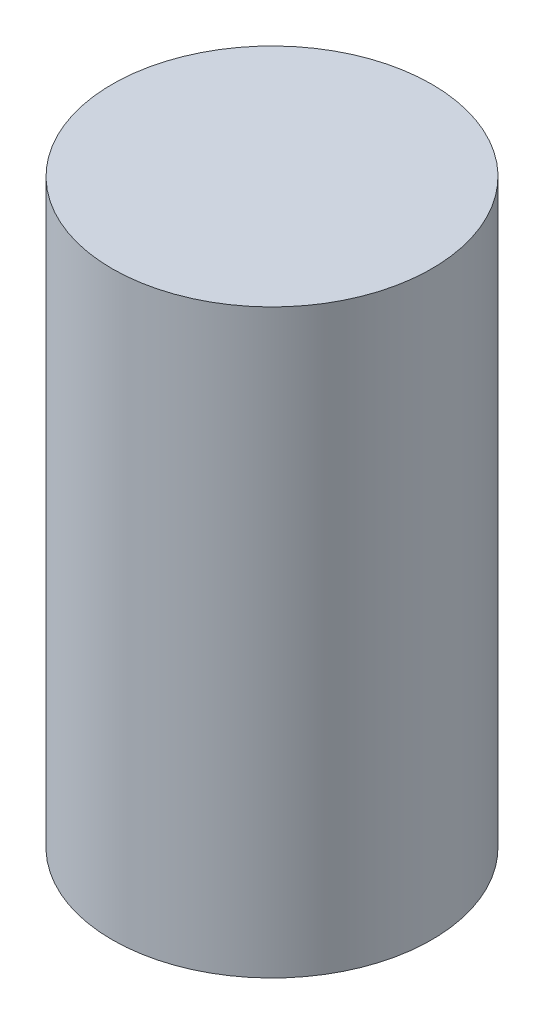
ISO-10303-21;
HEADER;
FILE_DESCRIPTION(('STEP AP214'),'2;1');
FILE_NAME('part.step','',(''),(''),'','','');
FILE_SCHEMA(('AUTOMOTIVE_DESIGN { 1 0 10303 214 1 1 1 1 }'));
ENDSEC;
DATA;
#1=APPLICATION_CONTEXT('core data for automotive mechanical design processes');
#2=APPLICATION_PROTOCOL_DEFINITION('international standard','automotive_design',2000,#1);
#3=PRODUCT_CONTEXT('',#1,'mechanical');
#4=PRODUCT('Part','Part','',(#3));
#5=PRODUCT_RELATED_PRODUCT_CATEGORY('part','',(#4));
#6=PRODUCT_DEFINITION_FORMATION('','',#4);
#7=PRODUCT_DEFINITION_CONTEXT('part definition',#1,'design');
#8=PRODUCT_DEFINITION('design','',#6,#7);
#9=PRODUCT_DEFINITION_SHAPE('','',#8);
#10=(LENGTH_UNIT() NAMED_UNIT(*) SI_UNIT(.MILLI.,.METRE.));
#11=(NAMED_UNIT(*) PLANE_ANGLE_UNIT() SI_UNIT($,.RADIAN.));
#12=(NAMED_UNIT(*) SI_UNIT($,.STERADIAN.) SOLID_ANGLE_UNIT());
#13=UNCERTAINTY_MEASURE_WITH_UNIT(LENGTH_MEASURE(1.E-05),#10,'distance_accuracy_value','');
#14=(GEOMETRIC_REPRESENTATION_CONTEXT(3) GLOBAL_UNCERTAINTY_ASSIGNED_CONTEXT((#13)) GLOBAL_UNIT_ASSIGNED_CONTEXT((#10,
#11,#12)) REPRESENTATION_CONTEXT('',''));
#15=CARTESIAN_POINT('',(0.,0.,0.));
#16=DIRECTION('',(0.,0.,1.));
#17=DIRECTION('',(1.,0.,0.));
#18=AXIS2_PLACEMENT_3D('',#15,#16,#17);
#19=CARTESIAN_POINT('',(0.,50.,0.));
#20=DIRECTION('',(0.,-1.,0.));
#21=DIRECTION('',(0.,0.,-1.));
#22=AXIS2_PLACEMENT_3D('',#19,#20,#21);
#23=CYLINDRICAL_SURFACE('',#22,13.75);
#24=CARTESIAN_POINT('',(0.,50.,0.));
#25=DIRECTION('',(0.,1.,0.));
#26=DIRECTION('',(0.,0.,1.));
#27=AXIS2_PLACEMENT_3D('',#24,#25,#26);
#28=CIRCLE('',#27,13.75);
#29=CARTESIAN_POINT('',(0.,50.,13.75));
#30=VERTEX_POINT('',#29);
#31=EDGE_CURVE('E10',#30,#30,#28,.T.);
#32=ORIENTED_EDGE('',*,*,#31,.F.);
#33=EDGE_LOOP('',(#32));
#34=FACE_BOUND('',#33,.T.);
#35=CARTESIAN_POINT('',(0.,0.,0.));
#36=DIRECTION('',(0.,1.,0.));
#37=DIRECTION('',(0.,0.,1.));
#38=AXIS2_PLACEMENT_3D('',#35,#36,#37);
#39=CIRCLE('',#38,13.75);
#40=CARTESIAN_POINT('',(0.,0.,13.75));
#41=VERTEX_POINT('',#40);
#42=EDGE_CURVE('E37',#41,#41,#39,.T.);
#43=ORIENTED_EDGE('',*,*,#42,.T.);
#44=EDGE_LOOP('',(#43));
#45=FACE_BOUND('',#44,.T.);
#46=ADVANCED_FACE('F34',(#34,#45),#23,.T.);
#47=CARTESIAN_POINT('',(0.,50.,0.));
#48=DIRECTION('',(0.,1.,0.));
#49=DIRECTION('',(0.,0.,1.));
#50=AXIS2_PLACEMENT_3D('',#47,#48,#49);
#51=PLANE('',#50);
#52=ORIENTED_EDGE('',*,*,#31,.T.);
#53=EDGE_LOOP('',(#52));
#54=FACE_BOUND('',#53,.T.);
#55=ADVANCED_FACE('F49',(#54),#51,.T.);
#56=CARTESIAN_POINT('',(0.,0.,0.));
#57=DIRECTION('',(0.,1.,0.));
#58=DIRECTION('',(0.,0.,1.));
#59=AXIS2_PLACEMENT_3D('',#56,#57,#58);
#60=PLANE('',#59);
#61=ORIENTED_EDGE('',*,*,#42,.F.);
#62=EDGE_LOOP('',(#61));
#63=FACE_BOUND('',#62,.T.);
#64=ADVANCED_FACE('F47',(#63),#60,.F.);
#65=CLOSED_SHELL('',(#46,#55,#64));
#66=MANIFOLD_SOLID_BREP('B2',#65);
#67=ADVANCED_BREP_SHAPE_REPRESENTATION('',(#18,#66),#14);
#68=SHAPE_DEFINITION_REPRESENTATION(#9,#67);
ENDSEC;
END-ISO-10303-21;
